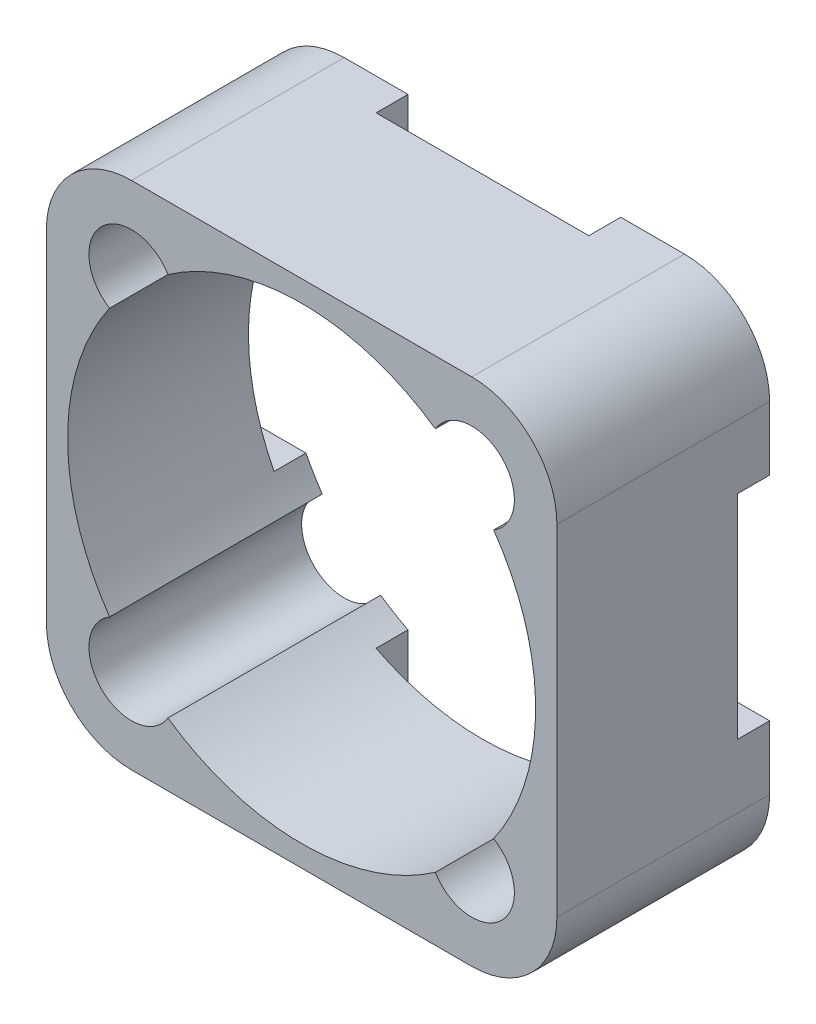
ISO-10303-21;
HEADER;
FILE_DESCRIPTION(('STEP AP214'),'2;1');
FILE_NAME('part.step','',(''),(''),'','','');
FILE_SCHEMA(('AUTOMOTIVE_DESIGN { 1 0 10303 214 1 1 1 1 }'));
ENDSEC;
DATA;
#1=APPLICATION_CONTEXT('core data for automotive mechanical design processes');
#2=APPLICATION_PROTOCOL_DEFINITION('international standard','automotive_design',2000,#1);
#3=PRODUCT_CONTEXT('',#1,'mechanical');
#4=PRODUCT('Part','Part','',(#3));
#5=PRODUCT_RELATED_PRODUCT_CATEGORY('part','',(#4));
#6=PRODUCT_DEFINITION_FORMATION('','',#4);
#7=PRODUCT_DEFINITION_CONTEXT('part definition',#1,'design');
#8=PRODUCT_DEFINITION('design','',#6,#7);
#9=PRODUCT_DEFINITION_SHAPE('','',#8);
#10=(LENGTH_UNIT() NAMED_UNIT(*) SI_UNIT(.MILLI.,.METRE.));
#11=(NAMED_UNIT(*) PLANE_ANGLE_UNIT() SI_UNIT($,.RADIAN.));
#12=(NAMED_UNIT(*) SI_UNIT($,.STERADIAN.) SOLID_ANGLE_UNIT());
#13=UNCERTAINTY_MEASURE_WITH_UNIT(LENGTH_MEASURE(1.E-05),#10,'distance_accuracy_value','');
#14=(GEOMETRIC_REPRESENTATION_CONTEXT(3) GLOBAL_UNCERTAINTY_ASSIGNED_CONTEXT((#13)) GLOBAL_UNIT_ASSIGNED_CONTEXT((#10,
#11,#12)) REPRESENTATION_CONTEXT('',''));
#15=CARTESIAN_POINT('',(0.,0.,0.));
#16=DIRECTION('',(0.,0.,1.));
#17=DIRECTION('',(1.,0.,0.));
#18=AXIS2_PLACEMENT_3D('',#15,#16,#17);
#19=CARTESIAN_POINT('',(-6.12,-6.12,0.92));
#20=DIRECTION('',(0.,0.,-1.));
#21=DIRECTION('',(-1.,0.,0.));
#22=AXIS2_PLACEMENT_3D('',#19,#20,#21);
#23=PLANE('',#22);
#24=DIRECTION('',(1.,0.,0.));
#25=VECTOR('',#24,1.);
#26=CARTESIAN_POINT('',(4.,-6.,0.92));
#27=LINE('',#26,#25);
#28=CARTESIAN_POINT('',(2.5,-6.,0.92));
#29=VERTEX_POINT('',#28);
#30=CARTESIAN_POINT('',(4.,-6.,0.92));
#31=VERTEX_POINT('',#30);
#32=EDGE_CURVE('E252',#29,#31,#27,.T.);
#33=ORIENTED_EDGE('',*,*,#32,.F.);
#34=DIRECTION('',(0.,1.,0.));
#35=VECTOR('',#34,1.);
#36=CARTESIAN_POINT('',(2.5,-11.,0.92));
#37=LINE('',#36,#35);
#38=CARTESIAN_POINT('',(2.49999999999996,-4.89897948556635,0.919999999999999));
#39=VERTEX_POINT('',#38);
#40=EDGE_CURVE('E197',#39,#29,#37,.F.);
#41=ORIENTED_EDGE('',*,*,#40,.F.);
#42=CARTESIAN_POINT('',(0.,-6.36457823692605E-13,0.919999999999998));
#43=DIRECTION('',(0.,0.,-1.));
#44=DIRECTION('',(0.,1.,0.));
#45=AXIS2_PLACEMENT_3D('',#42,#43,#44);
#46=CIRCLE('',#45,5.49999999999939);
#47=CARTESIAN_POINT('',(3.142224872887,-4.51402512711325,0.92));
#48=VERTEX_POINT('',#47);
#49=EDGE_CURVE('E21',#39,#48,#46,.F.);
#50=ORIENTED_EDGE('',*,*,#49,.T.);
#51=CARTESIAN_POINT('',(4.00000000000066,-3.99999999999867,0.92));
#52=DIRECTION('',(0.,0.,-1.));
#53=DIRECTION('',(-1.,0.,0.));
#54=AXIS2_PLACEMENT_3D('',#51,#52,#53);
#55=CIRCLE('',#54,0.999999999998758);
#56=CARTESIAN_POINT('',(4.51402512711403,-3.14222487288588,0.92));
#57=VERTEX_POINT('',#56);
#58=EDGE_CURVE('E194',#57,#48,#55,.T.);
#59=ORIENTED_EDGE('',*,*,#58,.F.);
#60=CARTESIAN_POINT('',(6.35156781085623E-13,0.,0.919999999999998));
#61=DIRECTION('',(0.,0.,-1.));
#62=DIRECTION('',(-1.,0.,0.));
#63=AXIS2_PLACEMENT_3D('',#60,#61,#62);
#64=CIRCLE('',#63,5.49999999999939);
#65=CARTESIAN_POINT('',(4.89897948556636,-2.49999999999995,0.919999999999999));
#66=VERTEX_POINT('',#65);
#67=EDGE_CURVE('E199',#57,#66,#64,.F.);
#68=ORIENTED_EDGE('',*,*,#67,.T.);
#69=DIRECTION('',(1.,0.,0.));
#70=VECTOR('',#69,1.);
#71=CARTESIAN_POINT('',(11.,-2.5,0.92));
#72=LINE('',#71,#70);
#73=CARTESIAN_POINT('',(6.,-2.5,0.92));
#74=VERTEX_POINT('',#73);
#75=EDGE_CURVE('E261',#74,#66,#72,.F.);
#76=ORIENTED_EDGE('',*,*,#75,.F.);
#77=DIRECTION('',(0.,1.,0.));
#78=VECTOR('',#77,1.);
#79=CARTESIAN_POINT('',(6.,4.,0.92));
#80=LINE('',#79,#78);
#81=CARTESIAN_POINT('',(6.,-4.,0.92));
#82=VERTEX_POINT('',#81);
#83=EDGE_CURVE('E239',#82,#74,#80,.T.);
#84=ORIENTED_EDGE('',*,*,#83,.F.);
#85=CARTESIAN_POINT('',(4.,-4.,0.920000000000001));
#86=DIRECTION('',(0.,0.,-1.));
#87=DIRECTION('',(-1.,0.,0.));
#88=AXIS2_PLACEMENT_3D('',#85,#86,#87);
#89=CIRCLE('',#88,2.00000000000007);
#90=EDGE_CURVE('E247',#31,#82,#89,.F.);
#91=ORIENTED_EDGE('',*,*,#90,.F.);
#92=EDGE_LOOP('',(#33,#41,#50,#59,#68,#76,#84,#91));
#93=FACE_BOUND('',#92,.T.);
#94=ADVANCED_FACE('F17',(#93),#23,.T.);
#95=CARTESIAN_POINT('',(-2.5,-11.,-2.33));
#96=DIRECTION('',(1.,0.,0.));
#97=DIRECTION('',(0.,0.,-1.));
#98=AXIS2_PLACEMENT_3D('',#95,#96,#97);
#99=PLANE('',#98);
#100=DIRECTION('',(0.,1.,0.));
#101=VECTOR('',#100,1.);
#102=CARTESIAN_POINT('',(-2.5,-11.,1.67));
#103=LINE('',#102,#101);
#104=CARTESIAN_POINT('',(-2.5,-6.,1.67));
#105=VERTEX_POINT('',#104);
#106=CARTESIAN_POINT('',(-2.49999999999996,-4.89897948556635,1.67));
#107=VERTEX_POINT('',#106);
#108=EDGE_CURVE('E346',#105,#107,#103,.T.);
#109=ORIENTED_EDGE('',*,*,#108,.F.);
#110=DIRECTION('',(0.,0.,-1.));
#111=VECTOR('',#110,1.);
#112=CARTESIAN_POINT('',(-2.5,-6.,5.92));
#113=LINE('',#112,#111);
#114=CARTESIAN_POINT('',(-2.5,-6.,0.92));
#115=VERTEX_POINT('',#114);
#116=EDGE_CURVE('E421',#115,#105,#113,.F.);
#117=ORIENTED_EDGE('',*,*,#116,.F.);
#118=DIRECTION('',(0.,1.,0.));
#119=VECTOR('',#118,1.);
#120=CARTESIAN_POINT('',(-2.5,-6.12,0.92));
#121=LINE('',#120,#119);
#122=CARTESIAN_POINT('',(-2.49999999999996,-4.89897948556635,0.919999999999999));
#123=VERTEX_POINT('',#122);
#124=EDGE_CURVE('E328',#123,#115,#121,.F.);
#125=ORIENTED_EDGE('',*,*,#124,.F.);
#126=DIRECTION('',(0.,0.,-1.));
#127=VECTOR('',#126,1.);
#128=CARTESIAN_POINT('',(-2.49999999999991,-4.89897948556641,3.42));
#129=LINE('',#128,#127);
#130=EDGE_CURVE('E206',#107,#123,#129,.T.);
#131=ORIENTED_EDGE('',*,*,#130,.F.);
#132=EDGE_LOOP('',(#109,#117,#125,#131));
#133=FACE_BOUND('',#132,.T.);
#134=ADVANCED_FACE('F566',(#133),#99,.T.);
#135=CARTESIAN_POINT('',(2.5,-11.,1.67));
#136=DIRECTION('',(-1.,0.,0.));
#137=DIRECTION('',(0.,0.,1.));
#138=AXIS2_PLACEMENT_3D('',#135,#136,#137);
#139=PLANE('',#138);
#140=DIRECTION('',(0.,1.,0.));
#141=VECTOR('',#140,1.);
#142=CARTESIAN_POINT('',(2.5,-11.,1.67));
#143=LINE('',#142,#141);
#144=CARTESIAN_POINT('',(2.49999999999996,-4.89897948556635,1.67));
#145=VERTEX_POINT('',#144);
#146=CARTESIAN_POINT('',(2.5,-6.,1.67));
#147=VERTEX_POINT('',#146);
#148=EDGE_CURVE('E349',#145,#147,#143,.F.);
#149=ORIENTED_EDGE('',*,*,#148,.F.);
#150=DIRECTION('',(0.,0.,1.));
#151=VECTOR('',#150,1.);
#152=CARTESIAN_POINT('',(2.49999999999991,-4.8989794855664,3.42));
#153=LINE('',#152,#151);
#154=EDGE_CURVE('E213',#39,#145,#153,.T.);
#155=ORIENTED_EDGE('',*,*,#154,.F.);
#156=ORIENTED_EDGE('',*,*,#40,.T.);
#157=DIRECTION('',(0.,0.,-1.));
#158=VECTOR('',#157,1.);
#159=CARTESIAN_POINT('',(2.5,-6.,5.92));
#160=LINE('',#159,#158);
#161=EDGE_CURVE('E414',#147,#29,#160,.T.);
#162=ORIENTED_EDGE('',*,*,#161,.F.);
#163=EDGE_LOOP('',(#149,#155,#156,#162));
#164=FACE_BOUND('',#163,.T.);
#165=ADVANCED_FACE('F558',(#164),#139,.T.);
#166=CARTESIAN_POINT('',(-2.5,-11.,1.67));
#167=DIRECTION('',(0.,0.,-1.));
#168=DIRECTION('',(-1.,0.,0.));
#169=AXIS2_PLACEMENT_3D('',#166,#167,#168);
#170=PLANE('',#169);
#171=DIRECTION('',(1.,0.,0.));
#172=VECTOR('',#171,1.);
#173=CARTESIAN_POINT('',(4.,-6.,1.67));
#174=LINE('',#173,#172);
#175=EDGE_CURVE('E424',#105,#147,#174,.T.);
#176=ORIENTED_EDGE('',*,*,#175,.F.);
#177=ORIENTED_EDGE('',*,*,#108,.T.);
#178=CARTESIAN_POINT('',(0.,-6.36160416839492E-13,1.67));
#179=DIRECTION('',(0.,0.,-1.));
#180=DIRECTION('',(0.,1.,0.));
#181=AXIS2_PLACEMENT_3D('',#178,#179,#180);
#182=CIRCLE('',#181,5.49999999999939);
#183=EDGE_CURVE('E216',#145,#107,#182,.T.);
#184=ORIENTED_EDGE('',*,*,#183,.F.);
#185=ORIENTED_EDGE('',*,*,#148,.T.);
#186=EDGE_LOOP('',(#176,#177,#184,#185));
#187=FACE_BOUND('',#186,.T.);
#188=ADVANCED_FACE('F562',(#187),#170,.T.);
#189=CARTESIAN_POINT('',(-6.12,-6.12,0.92));
#190=DIRECTION('',(0.,0.,-1.));
#191=DIRECTION('',(-1.,0.,0.));
#192=AXIS2_PLACEMENT_3D('',#189,#190,#191);
#193=PLANE('',#192);
#194=CARTESIAN_POINT('',(0.,-6.36457823692605E-13,0.919999999999998));
#195=DIRECTION('',(0.,0.,-1.));
#196=DIRECTION('',(0.,1.,0.));
#197=AXIS2_PLACEMENT_3D('',#194,#195,#196);
#198=CIRCLE('',#197,5.49999999999939);
#199=CARTESIAN_POINT('',(-3.14222487288588,-4.51402512711403,0.92));
#200=VERTEX_POINT('',#199);
#201=EDGE_CURVE('E214',#123,#200,#198,.T.);
#202=ORIENTED_EDGE('',*,*,#201,.F.);
#203=ORIENTED_EDGE('',*,*,#124,.T.);
#204=DIRECTION('',(1.,0.,0.));
#205=VECTOR('',#204,1.);
#206=CARTESIAN_POINT('',(4.,-6.,0.92));
#207=LINE('',#206,#205);
#208=CARTESIAN_POINT('',(-4.,-6.,0.92));
#209=VERTEX_POINT('',#208);
#210=EDGE_CURVE('E248',#209,#115,#207,.T.);
#211=ORIENTED_EDGE('',*,*,#210,.F.);
#212=CARTESIAN_POINT('',(-4.,-4.,0.920000000000001));
#213=DIRECTION('',(0.,0.,-1.));
#214=DIRECTION('',(-1.,0.,0.));
#215=AXIS2_PLACEMENT_3D('',#212,#213,#214);
#216=CIRCLE('',#215,2.00000000000007);
#217=CARTESIAN_POINT('',(-6.,-4.,0.92));
#218=VERTEX_POINT('',#217);
#219=EDGE_CURVE('E256',#218,#209,#216,.F.);
#220=ORIENTED_EDGE('',*,*,#219,.F.);
#221=DIRECTION('',(0.,1.,0.));
#222=VECTOR('',#221,1.);
#223=CARTESIAN_POINT('',(-6.,-4.,0.92));
#224=LINE('',#223,#222);
#225=CARTESIAN_POINT('',(-6.,-2.5,0.92));
#226=VERTEX_POINT('',#225);
#227=EDGE_CURVE('E363',#226,#218,#224,.F.);
#228=ORIENTED_EDGE('',*,*,#227,.F.);
#229=DIRECTION('',(1.,0.,0.));
#230=VECTOR('',#229,1.);
#231=CARTESIAN_POINT('',(11.,-2.5,0.92));
#232=LINE('',#231,#230);
#233=CARTESIAN_POINT('',(-4.89897948556635,-2.49999999999995,0.919999999999999));
#234=VERTEX_POINT('',#233);
#235=EDGE_CURVE('E333',#234,#226,#232,.F.);
#236=ORIENTED_EDGE('',*,*,#235,.F.);
#237=CARTESIAN_POINT('',(-6.35156781085623E-13,0.,0.919999999999998));
#238=DIRECTION('',(0.,0.,-1.));
#239=DIRECTION('',(-1.,0.,0.));
#240=AXIS2_PLACEMENT_3D('',#237,#238,#239);
#241=CIRCLE('',#240,5.49999999999939);
#242=CARTESIAN_POINT('',(-4.51402512711325,-3.142224872887,0.92));
#243=VERTEX_POINT('',#242);
#244=EDGE_CURVE('E343',#234,#243,#241,.F.);
#245=ORIENTED_EDGE('',*,*,#244,.T.);
#246=CARTESIAN_POINT('',(-3.99999999999867,-4.00000000000066,0.92));
#247=DIRECTION('',(0.,0.,-1.));
#248=DIRECTION('',(-1.,0.,0.));
#249=AXIS2_PLACEMENT_3D('',#246,#247,#248);
#250=CIRCLE('',#249,0.999999999998758);
#251=EDGE_CURVE('E502',#200,#243,#250,.T.);
#252=ORIENTED_EDGE('',*,*,#251,.F.);
#253=EDGE_LOOP('',(#202,#203,#211,#220,#228,#236,#245,#252));
#254=FACE_BOUND('',#253,.T.);
#255=ADVANCED_FACE('F569',(#254),#193,.T.);
#256=CARTESIAN_POINT('',(11.,-2.5,1.67));
#257=DIRECTION('',(0.,0.,-1.));
#258=DIRECTION('',(-1.,0.,0.));
#259=AXIS2_PLACEMENT_3D('',#256,#257,#258);
#260=PLANE('',#259);
#261=DIRECTION('',(1.,0.,0.));
#262=VECTOR('',#261,1.);
#263=CARTESIAN_POINT('',(11.,-2.5,1.67));
#264=LINE('',#263,#262);
#265=CARTESIAN_POINT('',(-6.,-2.5,1.67));
#266=VERTEX_POINT('',#265);
#267=CARTESIAN_POINT('',(-4.89897948556635,-2.49999999999995,1.67));
#268=VERTEX_POINT('',#267);
#269=EDGE_CURVE('E327',#266,#268,#264,.T.);
#270=ORIENTED_EDGE('',*,*,#269,.F.);
#271=DIRECTION('',(0.,1.,0.));
#272=VECTOR('',#271,1.);
#273=CARTESIAN_POINT('',(-6.,-4.,1.67));
#274=LINE('',#273,#272);
#275=CARTESIAN_POINT('',(-6.,2.5,1.67));
#276=VERTEX_POINT('',#275);
#277=EDGE_CURVE('E441',#276,#266,#274,.F.);
#278=ORIENTED_EDGE('',*,*,#277,.F.);
#279=DIRECTION('',(1.,0.,0.));
#280=VECTOR('',#279,1.);
#281=CARTESIAN_POINT('',(11.,2.5,1.67));
#282=LINE('',#281,#280);
#283=CARTESIAN_POINT('',(-4.89897948556635,2.49999999999995,1.67));
#284=VERTEX_POINT('',#283);
#285=EDGE_CURVE('E324',#284,#276,#282,.F.);
#286=ORIENTED_EDGE('',*,*,#285,.F.);
#287=CARTESIAN_POINT('',(-6.34859374232509E-13,0.,1.67));
#288=DIRECTION('',(0.,0.,-1.));
#289=DIRECTION('',(-1.,0.,0.));
#290=AXIS2_PLACEMENT_3D('',#287,#288,#289);
#291=CIRCLE('',#290,5.49999999999939);
#292=EDGE_CURVE('E323',#268,#284,#291,.T.);
#293=ORIENTED_EDGE('',*,*,#292,.F.);
#294=EDGE_LOOP('',(#270,#278,#286,#293));
#295=FACE_BOUND('',#294,.T.);
#296=ADVANCED_FACE('F667',(#295),#260,.T.);
#297=CARTESIAN_POINT('',(11.,2.5,1.67));
#298=DIRECTION('',(0.,-1.,0.));
#299=DIRECTION('',(0.,0.,-1.));
#300=AXIS2_PLACEMENT_3D('',#297,#298,#299);
#301=PLANE('',#300);
#302=ORIENTED_EDGE('',*,*,#285,.T.);
#303=DIRECTION('',(0.,0.,1.));
#304=VECTOR('',#303,1.);
#305=CARTESIAN_POINT('',(-6.,2.5,5.92));
#306=LINE('',#305,#304);
#307=CARTESIAN_POINT('',(-6.,2.5,0.92));
#308=VERTEX_POINT('',#307);
#309=EDGE_CURVE('E276',#308,#276,#306,.T.);
#310=ORIENTED_EDGE('',*,*,#309,.F.);
#311=DIRECTION('',(-1.,0.,0.));
#312=VECTOR('',#311,1.);
#313=CARTESIAN_POINT('',(-6.12,2.5,0.92));
#314=LINE('',#313,#312);
#315=CARTESIAN_POINT('',(-4.89897948556635,2.49999999999995,0.919999999999999));
#316=VERTEX_POINT('',#315);
#317=EDGE_CURVE('E311',#316,#308,#314,.T.);
#318=ORIENTED_EDGE('',*,*,#317,.F.);
#319=DIRECTION('',(0.,0.,-1.));
#320=VECTOR('',#319,1.);
#321=CARTESIAN_POINT('',(-4.8989794855664,2.49999999999991,3.42));
#322=LINE('',#321,#320);
#323=EDGE_CURVE('E319',#284,#316,#322,.T.);
#324=ORIENTED_EDGE('',*,*,#323,.F.);
#325=EDGE_LOOP('',(#302,#310,#318,#324));
#326=FACE_BOUND('',#325,.T.);
#327=ADVANCED_FACE('F663',(#326),#301,.T.);
#328=CARTESIAN_POINT('',(11.,-2.5,-2.33));
#329=DIRECTION('',(0.,1.,0.));
#330=DIRECTION('',(0.,0.,1.));
#331=AXIS2_PLACEMENT_3D('',#328,#329,#330);
#332=PLANE('',#331);
#333=ORIENTED_EDGE('',*,*,#235,.T.);
#334=DIRECTION('',(0.,0.,1.));
#335=VECTOR('',#334,1.);
#336=CARTESIAN_POINT('',(-6.,-2.5,5.92));
#337=LINE('',#336,#335);
#338=EDGE_CURVE('E436',#266,#226,#337,.F.);
#339=ORIENTED_EDGE('',*,*,#338,.F.);
#340=ORIENTED_EDGE('',*,*,#269,.T.);
#341=DIRECTION('',(0.,0.,1.));
#342=VECTOR('',#341,1.);
#343=CARTESIAN_POINT('',(-4.8989794855664,-2.49999999999991,3.42));
#344=LINE('',#343,#342);
#345=EDGE_CURVE('E336',#234,#268,#344,.T.);
#346=ORIENTED_EDGE('',*,*,#345,.F.);
#347=EDGE_LOOP('',(#333,#339,#340,#346));
#348=FACE_BOUND('',#347,.T.);
#349=ADVANCED_FACE('F659',(#348),#332,.T.);
#350=CARTESIAN_POINT('',(-6.12,-6.12,0.92));
#351=DIRECTION('',(0.,0.,-1.));
#352=DIRECTION('',(-1.,0.,0.));
#353=AXIS2_PLACEMENT_3D('',#350,#351,#352);
#354=PLANE('',#353);
#355=DIRECTION('',(1.,0.,0.));
#356=VECTOR('',#355,1.);
#357=CARTESIAN_POINT('',(-4.,6.,0.92));
#358=LINE('',#357,#356);
#359=CARTESIAN_POINT('',(-2.5,6.,0.92));
#360=VERTEX_POINT('',#359);
#361=CARTESIAN_POINT('',(-4.,6.,0.92));
#362=VERTEX_POINT('',#361);
#363=EDGE_CURVE('E234',#360,#362,#358,.F.);
#364=ORIENTED_EDGE('',*,*,#363,.F.);
#365=DIRECTION('',(0.,1.,0.));
#366=VECTOR('',#365,1.);
#367=CARTESIAN_POINT('',(-2.5,-11.,0.92));
#368=LINE('',#367,#366);
#369=CARTESIAN_POINT('',(-2.49999999999995,4.89897948556636,0.919999999999999));
#370=VERTEX_POINT('',#369);
#371=EDGE_CURVE('E293',#370,#360,#368,.T.);
#372=ORIENTED_EDGE('',*,*,#371,.F.);
#373=CARTESIAN_POINT('',(0.,6.36024142823611E-13,0.919999999999998));
#374=DIRECTION('',(0.,0.,-1.));
#375=DIRECTION('',(0.,1.,0.));
#376=AXIS2_PLACEMENT_3D('',#373,#374,#375);
#377=CIRCLE('',#376,5.49999999999939);
#378=CARTESIAN_POINT('',(-3.142224872887,4.51402512711325,0.92));
#379=VERTEX_POINT('',#378);
#380=EDGE_CURVE('E316',#370,#379,#377,.F.);
#381=ORIENTED_EDGE('',*,*,#380,.T.);
#382=CARTESIAN_POINT('',(-4.00000000000066,3.99999999999867,0.92));
#383=DIRECTION('',(0.,0.,-1.));
#384=DIRECTION('',(-1.,0.,0.));
#385=AXIS2_PLACEMENT_3D('',#382,#383,#384);
#386=CIRCLE('',#385,0.999999999998758);
#387=CARTESIAN_POINT('',(-4.51402512711403,3.14222487288588,0.92));
#388=VERTEX_POINT('',#387);
#389=EDGE_CURVE('E496',#388,#379,#386,.T.);
#390=ORIENTED_EDGE('',*,*,#389,.F.);
#391=CARTESIAN_POINT('',(-6.35156781085623E-13,0.,0.919999999999998));
#392=DIRECTION('',(0.,0.,-1.));
#393=DIRECTION('',(-1.,0.,0.));
#394=AXIS2_PLACEMENT_3D('',#391,#392,#393);
#395=CIRCLE('',#394,5.49999999999939);
#396=EDGE_CURVE('E322',#316,#388,#395,.T.);
#397=ORIENTED_EDGE('',*,*,#396,.F.);
#398=ORIENTED_EDGE('',*,*,#317,.T.);
#399=DIRECTION('',(0.,1.,0.));
#400=VECTOR('',#399,1.);
#401=CARTESIAN_POINT('',(-6.,-4.,0.92));
#402=LINE('',#401,#400);
#403=CARTESIAN_POINT('',(-6.,4.,0.92));
#404=VERTEX_POINT('',#403);
#405=EDGE_CURVE('E257',#404,#308,#402,.F.);
#406=ORIENTED_EDGE('',*,*,#405,.F.);
#407=CARTESIAN_POINT('',(-4.,4.,0.920000000000001));
#408=DIRECTION('',(0.,0.,-1.));
#409=DIRECTION('',(-1.,0.,0.));
#410=AXIS2_PLACEMENT_3D('',#407,#408,#409);
#411=CIRCLE('',#410,2.00000000000007);
#412=EDGE_CURVE('E225',#362,#404,#411,.F.);
#413=ORIENTED_EDGE('',*,*,#412,.F.);
#414=EDGE_LOOP('',(#364,#372,#381,#390,#397,#398,#406,#413));
#415=FACE_BOUND('',#414,.T.);
#416=ADVANCED_FACE('F655',(#415),#354,.T.);
#417=CARTESIAN_POINT('',(-2.5,-11.,-2.33));
#418=DIRECTION('',(1.,0.,0.));
#419=DIRECTION('',(0.,0.,-1.));
#420=AXIS2_PLACEMENT_3D('',#417,#418,#419);
#421=PLANE('',#420);
#422=ORIENTED_EDGE('',*,*,#371,.T.);
#423=DIRECTION('',(0.,0.,1.));
#424=VECTOR('',#423,1.);
#425=CARTESIAN_POINT('',(-2.5,6.,5.92));
#426=LINE('',#425,#424);
#427=CARTESIAN_POINT('',(-2.5,6.,1.67));
#428=VERTEX_POINT('',#427);
#429=EDGE_CURVE('E367',#428,#360,#426,.F.);
#430=ORIENTED_EDGE('',*,*,#429,.F.);
#431=DIRECTION('',(0.,1.,0.));
#432=VECTOR('',#431,1.);
#433=CARTESIAN_POINT('',(-2.5,-11.,1.67));
#434=LINE('',#433,#432);
#435=CARTESIAN_POINT('',(-2.49999999999995,4.89897948556636,1.67));
#436=VERTEX_POINT('',#435);
#437=EDGE_CURVE('E289',#436,#428,#434,.T.);
#438=ORIENTED_EDGE('',*,*,#437,.F.);
#439=DIRECTION('',(0.,0.,1.));
#440=VECTOR('',#439,1.);
#441=CARTESIAN_POINT('',(-2.4999999999999,4.89897948556641,3.42));
#442=LINE('',#441,#440);
#443=EDGE_CURVE('E296',#370,#436,#442,.T.);
#444=ORIENTED_EDGE('',*,*,#443,.F.);
#445=EDGE_LOOP('',(#422,#430,#438,#444));
#446=FACE_BOUND('',#445,.T.);
#447=ADVANCED_FACE('F651',(#446),#421,.T.);
#448=CARTESIAN_POINT('',(-2.5,-11.,1.67));
#449=DIRECTION('',(0.,0.,-1.));
#450=DIRECTION('',(-1.,0.,0.));
#451=AXIS2_PLACEMENT_3D('',#448,#449,#450);
#452=PLANE('',#451);
#453=ORIENTED_EDGE('',*,*,#437,.T.);
#454=DIRECTION('',(1.,0.,0.));
#455=VECTOR('',#454,1.);
#456=CARTESIAN_POINT('',(-4.,6.,1.67));
#457=LINE('',#456,#455);
#458=CARTESIAN_POINT('',(2.5,6.,1.67));
#459=VERTEX_POINT('',#458);
#460=EDGE_CURVE('E229',#459,#428,#457,.F.);
#461=ORIENTED_EDGE('',*,*,#460,.F.);
#462=DIRECTION('',(0.,1.,0.));
#463=VECTOR('',#462,1.);
#464=CARTESIAN_POINT('',(2.5,-11.,1.67));
#465=LINE('',#464,#463);
#466=CARTESIAN_POINT('',(2.49999999999995,4.89897948556636,1.67));
#467=VERTEX_POINT('',#466);
#468=EDGE_CURVE('E292',#467,#459,#465,.T.);
#469=ORIENTED_EDGE('',*,*,#468,.F.);
#470=CARTESIAN_POINT('',(0.,6.35726735970498E-13,1.67));
#471=DIRECTION('',(0.,0.,-1.));
#472=DIRECTION('',(0.,1.,0.));
#473=AXIS2_PLACEMENT_3D('',#470,#471,#472);
#474=CIRCLE('',#473,5.49999999999939);
#475=EDGE_CURVE('E299',#436,#467,#474,.T.);
#476=ORIENTED_EDGE('',*,*,#475,.F.);
#477=EDGE_LOOP('',(#453,#461,#469,#476));
#478=FACE_BOUND('',#477,.T.);
#479=ADVANCED_FACE('F647',(#478),#452,.T.);
#480=CARTESIAN_POINT('',(2.5,-11.,1.67));
#481=DIRECTION('',(-1.,0.,0.));
#482=DIRECTION('',(0.,0.,1.));
#483=AXIS2_PLACEMENT_3D('',#480,#481,#482);
#484=PLANE('',#483);
#485=ORIENTED_EDGE('',*,*,#468,.T.);
#486=DIRECTION('',(0.,0.,1.));
#487=VECTOR('',#486,1.);
#488=CARTESIAN_POINT('',(2.5,6.,5.92));
#489=LINE('',#488,#487);
#490=CARTESIAN_POINT('',(2.5,6.,0.92));
#491=VERTEX_POINT('',#490);
#492=EDGE_CURVE('E372',#491,#459,#489,.T.);
#493=ORIENTED_EDGE('',*,*,#492,.F.);
#494=DIRECTION('',(0.,1.,0.));
#495=VECTOR('',#494,1.);
#496=CARTESIAN_POINT('',(2.5,-6.12,0.92));
#497=LINE('',#496,#495);
#498=CARTESIAN_POINT('',(2.49999999999995,4.89897948556636,0.919999999999999));
#499=VERTEX_POINT('',#498);
#500=EDGE_CURVE('E281',#499,#491,#497,.T.);
#501=ORIENTED_EDGE('',*,*,#500,.F.);
#502=DIRECTION('',(0.,0.,-1.));
#503=VECTOR('',#502,1.);
#504=CARTESIAN_POINT('',(2.49999999999991,4.8989794855664,3.42));
#505=LINE('',#504,#503);
#506=EDGE_CURVE('E301',#467,#499,#505,.T.);
#507=ORIENTED_EDGE('',*,*,#506,.F.);
#508=EDGE_LOOP('',(#485,#493,#501,#507));
#509=FACE_BOUND('',#508,.T.);
#510=ADVANCED_FACE('F643',(#509),#484,.T.);
#511=CARTESIAN_POINT('',(-6.12,-6.12,0.92));
#512=DIRECTION('',(0.,0.,-1.));
#513=DIRECTION('',(-1.,0.,0.));
#514=AXIS2_PLACEMENT_3D('',#511,#512,#513);
#515=PLANE('',#514);
#516=CARTESIAN_POINT('',(0.,6.36024142823611E-13,0.919999999999998));
#517=DIRECTION('',(0.,0.,-1.));
#518=DIRECTION('',(0.,1.,0.));
#519=AXIS2_PLACEMENT_3D('',#516,#517,#518);
#520=CIRCLE('',#519,5.49999999999939);
#521=CARTESIAN_POINT('',(3.14222487288588,4.51402512711403,0.92));
#522=VERTEX_POINT('',#521);
#523=EDGE_CURVE('E494',#499,#522,#520,.T.);
#524=ORIENTED_EDGE('',*,*,#523,.F.);
#525=ORIENTED_EDGE('',*,*,#500,.T.);
#526=DIRECTION('',(1.,0.,0.));
#527=VECTOR('',#526,1.);
#528=CARTESIAN_POINT('',(-4.,6.,0.92));
#529=LINE('',#528,#527);
#530=CARTESIAN_POINT('',(4.,6.,0.92));
#531=VERTEX_POINT('',#530);
#532=EDGE_CURVE('E233',#531,#491,#529,.F.);
#533=ORIENTED_EDGE('',*,*,#532,.F.);
#534=CARTESIAN_POINT('',(4.,4.,0.920000000000001));
#535=DIRECTION('',(0.,0.,-1.));
#536=DIRECTION('',(-1.,0.,0.));
#537=AXIS2_PLACEMENT_3D('',#534,#535,#536);
#538=CIRCLE('',#537,2.00000000000007);
#539=CARTESIAN_POINT('',(6.,4.,0.92));
#540=VERTEX_POINT('',#539);
#541=EDGE_CURVE('E238',#540,#531,#538,.F.);
#542=ORIENTED_EDGE('',*,*,#541,.F.);
#543=DIRECTION('',(0.,1.,0.));
#544=VECTOR('',#543,1.);
#545=CARTESIAN_POINT('',(6.,4.,0.92));
#546=LINE('',#545,#544);
#547=CARTESIAN_POINT('',(6.,2.5,0.92));
#548=VERTEX_POINT('',#547);
#549=EDGE_CURVE('E243',#548,#540,#546,.T.);
#550=ORIENTED_EDGE('',*,*,#549,.F.);
#551=DIRECTION('',(1.,0.,0.));
#552=VECTOR('',#551,1.);
#553=CARTESIAN_POINT('',(11.,2.5,0.92));
#554=LINE('',#553,#552);
#555=CARTESIAN_POINT('',(4.89897948556636,2.49999999999995,0.919999999999999));
#556=VERTEX_POINT('',#555);
#557=EDGE_CURVE('E262',#556,#548,#554,.T.);
#558=ORIENTED_EDGE('',*,*,#557,.F.);
#559=CARTESIAN_POINT('',(6.35156781085623E-13,0.,0.919999999999998));
#560=DIRECTION('',(0.,0.,-1.));
#561=DIRECTION('',(-1.,0.,0.));
#562=AXIS2_PLACEMENT_3D('',#559,#560,#561);
#563=CIRCLE('',#562,5.49999999999939);
#564=CARTESIAN_POINT('',(4.51402512711325,3.142224872887,0.92));
#565=VERTEX_POINT('',#564);
#566=EDGE_CURVE('E286',#556,#565,#563,.F.);
#567=ORIENTED_EDGE('',*,*,#566,.T.);
#568=CARTESIAN_POINT('',(3.99999999999867,4.00000000000066,0.92));
#569=DIRECTION('',(0.,0.,-1.));
#570=DIRECTION('',(-1.,0.,0.));
#571=AXIS2_PLACEMENT_3D('',#568,#569,#570);
#572=CIRCLE('',#571,0.999999999998758);
#573=EDGE_CURVE('E490',#522,#565,#572,.T.);
#574=ORIENTED_EDGE('',*,*,#573,.F.);
#575=EDGE_LOOP('',(#524,#525,#533,#542,#550,#558,#567,#574));
#576=FACE_BOUND('',#575,.T.);
#577=ADVANCED_FACE('F639',(#576),#515,.T.);
#578=CARTESIAN_POINT('',(11.,2.5,1.67));
#579=DIRECTION('',(0.,-1.,0.));
#580=DIRECTION('',(0.,0.,-1.));
#581=AXIS2_PLACEMENT_3D('',#578,#579,#580);
#582=PLANE('',#581);
#583=DIRECTION('',(-1.,0.,0.));
#584=VECTOR('',#583,1.);
#585=CARTESIAN_POINT('',(11.,2.5,1.67));
#586=LINE('',#585,#584);
#587=CARTESIAN_POINT('',(4.89897948556636,2.49999999999995,1.67));
#588=VERTEX_POINT('',#587);
#589=CARTESIAN_POINT('',(6.,2.5,1.67));
#590=VERTEX_POINT('',#589);
#591=EDGE_CURVE('E258',#588,#590,#586,.F.);
#592=ORIENTED_EDGE('',*,*,#591,.F.);
#593=DIRECTION('',(0.,0.,1.));
#594=VECTOR('',#593,1.);
#595=CARTESIAN_POINT('',(4.89897948556641,2.49999999999991,3.42));
#596=LINE('',#595,#594);
#597=EDGE_CURVE('E265',#556,#588,#596,.T.);
#598=ORIENTED_EDGE('',*,*,#597,.F.);
#599=ORIENTED_EDGE('',*,*,#557,.T.);
#600=DIRECTION('',(0.,0.,-1.));
#601=VECTOR('',#600,1.);
#602=CARTESIAN_POINT('',(6.,2.5,5.92));
#603=LINE('',#602,#601);
#604=EDGE_CURVE('E388',#590,#548,#603,.T.);
#605=ORIENTED_EDGE('',*,*,#604,.F.);
#606=EDGE_LOOP('',(#592,#598,#599,#605));
#607=FACE_BOUND('',#606,.T.);
#608=ADVANCED_FACE('F636',(#607),#582,.T.);
#609=CARTESIAN_POINT('',(11.,-2.5,1.67));
#610=DIRECTION('',(0.,0.,-1.));
#611=DIRECTION('',(-1.,0.,0.));
#612=AXIS2_PLACEMENT_3D('',#609,#610,#611);
#613=PLANE('',#612);
#614=DIRECTION('',(0.,1.,0.));
#615=VECTOR('',#614,1.);
#616=CARTESIAN_POINT('',(6.,4.,1.67));
#617=LINE('',#616,#615);
#618=CARTESIAN_POINT('',(6.,-2.5,1.67));
#619=VERTEX_POINT('',#618);
#620=EDGE_CURVE('E398',#619,#590,#617,.T.);
#621=ORIENTED_EDGE('',*,*,#620,.F.);
#622=DIRECTION('',(1.,0.,0.));
#623=VECTOR('',#622,1.);
#624=CARTESIAN_POINT('',(11.,-2.5,1.67));
#625=LINE('',#624,#623);
#626=CARTESIAN_POINT('',(4.89897948556636,-2.49999999999995,1.67));
#627=VERTEX_POINT('',#626);
#628=EDGE_CURVE('E273',#627,#619,#625,.T.);
#629=ORIENTED_EDGE('',*,*,#628,.F.);
#630=CARTESIAN_POINT('',(6.34859374232509E-13,0.,1.67));
#631=DIRECTION('',(0.,0.,-1.));
#632=DIRECTION('',(-1.,0.,0.));
#633=AXIS2_PLACEMENT_3D('',#630,#631,#632);
#634=CIRCLE('',#633,5.49999999999939);
#635=EDGE_CURVE('E268',#588,#627,#634,.T.);
#636=ORIENTED_EDGE('',*,*,#635,.F.);
#637=ORIENTED_EDGE('',*,*,#591,.T.);
#638=EDGE_LOOP('',(#621,#629,#636,#637));
#639=FACE_BOUND('',#638,.T.);
#640=ADVANCED_FACE('F525',(#639),#613,.T.);
#641=CARTESIAN_POINT('',(11.,-2.5,-2.33));
#642=DIRECTION('',(0.,1.,0.));
#643=DIRECTION('',(0.,0.,1.));
#644=AXIS2_PLACEMENT_3D('',#641,#642,#643);
#645=PLANE('',#644);
#646=ORIENTED_EDGE('',*,*,#628,.T.);
#647=DIRECTION('',(0.,0.,-1.));
#648=VECTOR('',#647,1.);
#649=CARTESIAN_POINT('',(6.,-2.5,5.92));
#650=LINE('',#649,#648);
#651=EDGE_CURVE('E395',#74,#619,#650,.F.);
#652=ORIENTED_EDGE('',*,*,#651,.F.);
#653=ORIENTED_EDGE('',*,*,#75,.T.);
#654=DIRECTION('',(0.,0.,-1.));
#655=VECTOR('',#654,1.);
#656=CARTESIAN_POINT('',(4.89897948556641,-2.49999999999991,3.42));
#657=LINE('',#656,#655);
#658=EDGE_CURVE('E269',#627,#66,#657,.T.);
#659=ORIENTED_EDGE('',*,*,#658,.F.);
#660=EDGE_LOOP('',(#646,#652,#653,#659));
#661=FACE_BOUND('',#660,.T.);
#662=ADVANCED_FACE('F520',(#661),#645,.T.);
#663=CARTESIAN_POINT('',(-6.,-4.,5.92));
#664=DIRECTION('',(-1.,0.,0.));
#665=DIRECTION('',(0.,0.,1.));
#666=AXIS2_PLACEMENT_3D('',#663,#664,#665);
#667=PLANE('',#666);
#668=DIRECTION('',(0.,0.,1.));
#669=VECTOR('',#668,1.);
#670=CARTESIAN_POINT('',(-6.,4.,3.42));
#671=LINE('',#670,#669);
#672=CARTESIAN_POINT('',(-6.,4.,5.92));
#673=VERTEX_POINT('',#672);
#674=EDGE_CURVE('E207',#404,#673,#671,.T.);
#675=ORIENTED_EDGE('',*,*,#674,.F.);
#676=ORIENTED_EDGE('',*,*,#405,.T.);
#677=ORIENTED_EDGE('',*,*,#309,.T.);
#678=ORIENTED_EDGE('',*,*,#277,.T.);
#679=ORIENTED_EDGE('',*,*,#338,.T.);
#680=ORIENTED_EDGE('',*,*,#227,.T.);
#681=DIRECTION('',(0.,0.,-1.));
#682=VECTOR('',#681,1.);
#683=CARTESIAN_POINT('',(-6.,-4.,3.42));
#684=LINE('',#683,#682);
#685=CARTESIAN_POINT('',(-6.,-4.,5.92));
#686=VERTEX_POINT('',#685);
#687=EDGE_CURVE('E253',#686,#218,#684,.T.);
#688=ORIENTED_EDGE('',*,*,#687,.F.);
#689=DIRECTION('',(0.,1.,0.));
#690=VECTOR('',#689,1.);
#691=CARTESIAN_POINT('',(-6.,-6.12,5.92));
#692=LINE('',#691,#690);
#693=EDGE_CURVE('E272',#673,#686,#692,.F.);
#694=ORIENTED_EDGE('',*,*,#693,.F.);
#695=EDGE_LOOP('',(#675,#676,#677,#678,#679,#680,#688,#694));
#696=FACE_BOUND('',#695,.T.);
#697=ADVANCED_FACE('F628',(#696),#667,.T.);
#698=CARTESIAN_POINT('',(-4.,-4.,5.92));
#699=DIRECTION('',(0.,0.,-1.));
#700=DIRECTION('',(-1.,0.,0.));
#701=AXIS2_PLACEMENT_3D('',#698,#699,#700);
#702=CYLINDRICAL_SURFACE('',#701,2.00000000000007);
#703=ORIENTED_EDGE('',*,*,#219,.T.);
#704=DIRECTION('',(0.,0.,-1.));
#705=VECTOR('',#704,1.);
#706=CARTESIAN_POINT('',(-4.,-6.,5.92));
#707=LINE('',#706,#705);
#708=CARTESIAN_POINT('',(-4.,-6.,5.92));
#709=VERTEX_POINT('',#708);
#710=EDGE_CURVE('E249',#709,#209,#707,.T.);
#711=ORIENTED_EDGE('',*,*,#710,.F.);
#712=CARTESIAN_POINT('',(-4.,-4.,5.92));
#713=DIRECTION('',(0.,0.,-1.));
#714=DIRECTION('',(-1.,0.,0.));
#715=AXIS2_PLACEMENT_3D('',#712,#713,#714);
#716=CIRCLE('',#715,2.00000000000007);
#717=EDGE_CURVE('E485',#686,#709,#716,.F.);
#718=ORIENTED_EDGE('',*,*,#717,.F.);
#719=ORIENTED_EDGE('',*,*,#687,.T.);
#720=EDGE_LOOP('',(#703,#711,#718,#719));
#721=FACE_BOUND('',#720,.T.);
#722=ADVANCED_FACE('F627',(#721),#702,.T.);
#723=CARTESIAN_POINT('',(4.,-6.,5.92));
#724=DIRECTION('',(0.,-1.,0.));
#725=DIRECTION('',(0.,0.,-1.));
#726=AXIS2_PLACEMENT_3D('',#723,#724,#725);
#727=PLANE('',#726);
#728=ORIENTED_EDGE('',*,*,#710,.T.);
#729=ORIENTED_EDGE('',*,*,#210,.T.);
#730=ORIENTED_EDGE('',*,*,#116,.T.);
#731=ORIENTED_EDGE('',*,*,#175,.T.);
#732=ORIENTED_EDGE('',*,*,#161,.T.);
#733=ORIENTED_EDGE('',*,*,#32,.T.);
#734=DIRECTION('',(0.,0.,-1.));
#735=VECTOR('',#734,1.);
#736=CARTESIAN_POINT('',(4.,-6.,3.42));
#737=LINE('',#736,#735);
#738=CARTESIAN_POINT('',(4.,-6.,5.92));
#739=VERTEX_POINT('',#738);
#740=EDGE_CURVE('E244',#739,#31,#737,.T.);
#741=ORIENTED_EDGE('',*,*,#740,.F.);
#742=DIRECTION('',(1.,0.,0.));
#743=VECTOR('',#742,1.);
#744=CARTESIAN_POINT('',(-6.12,-6.,5.92));
#745=LINE('',#744,#743);
#746=EDGE_CURVE('E484',#709,#739,#745,.T.);
#747=ORIENTED_EDGE('',*,*,#746,.F.);
#748=EDGE_LOOP('',(#728,#729,#730,#731,#732,#733,#741,#747));
#749=FACE_BOUND('',#748,.T.);
#750=ADVANCED_FACE('F561',(#749),#727,.T.);
#751=CARTESIAN_POINT('',(4.,-4.,5.92));
#752=DIRECTION('',(0.,0.,-1.));
#753=DIRECTION('',(-1.,0.,0.));
#754=AXIS2_PLACEMENT_3D('',#751,#752,#753);
#755=CYLINDRICAL_SURFACE('',#754,2.00000000000007);
#756=ORIENTED_EDGE('',*,*,#90,.T.);
#757=DIRECTION('',(0.,0.,-1.));
#758=VECTOR('',#757,1.);
#759=CARTESIAN_POINT('',(6.,-4.,5.92));
#760=LINE('',#759,#758);
#761=CARTESIAN_POINT('',(6.,-4.,5.92));
#762=VERTEX_POINT('',#761);
#763=EDGE_CURVE('E240',#762,#82,#760,.T.);
#764=ORIENTED_EDGE('',*,*,#763,.F.);
#765=CARTESIAN_POINT('',(4.,-4.,5.92));
#766=DIRECTION('',(0.,0.,-1.));
#767=DIRECTION('',(-1.,0.,0.));
#768=AXIS2_PLACEMENT_3D('',#765,#766,#767);
#769=CIRCLE('',#768,2.00000000000007);
#770=EDGE_CURVE('E481',#739,#762,#769,.F.);
#771=ORIENTED_EDGE('',*,*,#770,.F.);
#772=ORIENTED_EDGE('',*,*,#740,.T.);
#773=EDGE_LOOP('',(#756,#764,#771,#772));
#774=FACE_BOUND('',#773,.T.);
#775=ADVANCED_FACE('F623',(#774),#755,.T.);
#776=CARTESIAN_POINT('',(6.,4.,5.92));
#777=DIRECTION('',(1.,0.,0.));
#778=DIRECTION('',(0.,0.,-1.));
#779=AXIS2_PLACEMENT_3D('',#776,#777,#778);
#780=PLANE('',#779);
#781=ORIENTED_EDGE('',*,*,#763,.T.);
#782=ORIENTED_EDGE('',*,*,#83,.T.);
#783=ORIENTED_EDGE('',*,*,#651,.T.);
#784=ORIENTED_EDGE('',*,*,#620,.T.);
#785=ORIENTED_EDGE('',*,*,#604,.T.);
#786=ORIENTED_EDGE('',*,*,#549,.T.);
#787=DIRECTION('',(0.,0.,-1.));
#788=VECTOR('',#787,1.);
#789=CARTESIAN_POINT('',(6.,4.,3.42));
#790=LINE('',#789,#788);
#791=CARTESIAN_POINT('',(6.,4.,5.92));
#792=VERTEX_POINT('',#791);
#793=EDGE_CURVE('E235',#792,#540,#790,.T.);
#794=ORIENTED_EDGE('',*,*,#793,.F.);
#795=DIRECTION('',(0.,1.,0.));
#796=VECTOR('',#795,1.);
#797=CARTESIAN_POINT('',(6.,-6.12,5.92));
#798=LINE('',#797,#796);
#799=EDGE_CURVE('E480',#762,#792,#798,.T.);
#800=ORIENTED_EDGE('',*,*,#799,.F.);
#801=EDGE_LOOP('',(#781,#782,#783,#784,#785,#786,#794,#800));
#802=FACE_BOUND('',#801,.T.);
#803=ADVANCED_FACE('F620',(#802),#780,.T.);
#804=CARTESIAN_POINT('',(4.,4.,5.92));
#805=DIRECTION('',(0.,0.,-1.));
#806=DIRECTION('',(-1.,0.,0.));
#807=AXIS2_PLACEMENT_3D('',#804,#805,#806);
#808=CYLINDRICAL_SURFACE('',#807,2.00000000000007);
#809=ORIENTED_EDGE('',*,*,#541,.T.);
#810=DIRECTION('',(0.,0.,1.));
#811=VECTOR('',#810,1.);
#812=CARTESIAN_POINT('',(4.,6.,5.92));
#813=LINE('',#812,#811);
#814=CARTESIAN_POINT('',(4.,6.,5.92));
#815=VERTEX_POINT('',#814);
#816=EDGE_CURVE('E230',#815,#531,#813,.F.);
#817=ORIENTED_EDGE('',*,*,#816,.F.);
#818=CARTESIAN_POINT('',(4.,4.,5.92));
#819=DIRECTION('',(0.,0.,-1.));
#820=DIRECTION('',(-1.,0.,0.));
#821=AXIS2_PLACEMENT_3D('',#818,#819,#820);
#822=CIRCLE('',#821,2.00000000000007);
#823=EDGE_CURVE('E477',#792,#815,#822,.F.);
#824=ORIENTED_EDGE('',*,*,#823,.F.);
#825=ORIENTED_EDGE('',*,*,#793,.T.);
#826=EDGE_LOOP('',(#809,#817,#824,#825));
#827=FACE_BOUND('',#826,.T.);
#828=ADVANCED_FACE('F618',(#827),#808,.T.);
#829=CARTESIAN_POINT('',(-4.,6.,5.92));
#830=DIRECTION('',(0.,1.,0.));
#831=DIRECTION('',(0.,0.,1.));
#832=AXIS2_PLACEMENT_3D('',#829,#830,#831);
#833=PLANE('',#832);
#834=ORIENTED_EDGE('',*,*,#492,.T.);
#835=ORIENTED_EDGE('',*,*,#460,.T.);
#836=ORIENTED_EDGE('',*,*,#429,.T.);
#837=ORIENTED_EDGE('',*,*,#363,.T.);
#838=DIRECTION('',(0.,0.,-1.));
#839=VECTOR('',#838,1.);
#840=CARTESIAN_POINT('',(-4.,6.,3.42));
#841=LINE('',#840,#839);
#842=CARTESIAN_POINT('',(-4.,6.,5.92));
#843=VERTEX_POINT('',#842);
#844=EDGE_CURVE('E226',#843,#362,#841,.T.);
#845=ORIENTED_EDGE('',*,*,#844,.F.);
#846=DIRECTION('',(1.,0.,0.));
#847=VECTOR('',#846,1.);
#848=CARTESIAN_POINT('',(-6.12,6.,5.92));
#849=LINE('',#848,#847);
#850=EDGE_CURVE('E476',#815,#843,#849,.F.);
#851=ORIENTED_EDGE('',*,*,#850,.F.);
#852=ORIENTED_EDGE('',*,*,#816,.T.);
#853=ORIENTED_EDGE('',*,*,#532,.T.);
#854=EDGE_LOOP('',(#834,#835,#836,#837,#845,#851,#852,#853));
#855=FACE_BOUND('',#854,.T.);
#856=ADVANCED_FACE('F614',(#855),#833,.T.);
#857=CARTESIAN_POINT('',(-4.,4.,5.92));
#858=DIRECTION('',(0.,0.,-1.));
#859=DIRECTION('',(-1.,0.,0.));
#860=AXIS2_PLACEMENT_3D('',#857,#858,#859);
#861=CYLINDRICAL_SURFACE('',#860,2.00000000000007);
#862=ORIENTED_EDGE('',*,*,#412,.T.);
#863=ORIENTED_EDGE('',*,*,#674,.T.);
#864=CARTESIAN_POINT('',(-4.,4.,5.92));
#865=DIRECTION('',(0.,0.,-1.));
#866=DIRECTION('',(-1.,0.,0.));
#867=AXIS2_PLACEMENT_3D('',#864,#865,#866);
#868=CIRCLE('',#867,2.00000000000007);
#869=EDGE_CURVE('E473',#843,#673,#868,.F.);
#870=ORIENTED_EDGE('',*,*,#869,.F.);
#871=ORIENTED_EDGE('',*,*,#844,.T.);
#872=EDGE_LOOP('',(#862,#863,#870,#871));
#873=FACE_BOUND('',#872,.T.);
#874=ADVANCED_FACE('F617',(#873),#861,.T.);
#875=CARTESIAN_POINT('',(4.00000000000066,-3.99999999999867,5.92));
#876=DIRECTION('',(0.,0.,-1.));
#877=DIRECTION('',(-1.,0.,0.));
#878=AXIS2_PLACEMENT_3D('',#875,#876,#877);
#879=CYLINDRICAL_SURFACE('',#878,0.999999999998758);
#880=DIRECTION('',(0.,0.,-1.));
#881=VECTOR('',#880,1.);
#882=CARTESIAN_POINT('',(3.142224872886,-4.514025127114,3.42));
#883=LINE('',#882,#881);
#884=CARTESIAN_POINT('',(3.142224872887,-4.51402512711325,5.92));
#885=VERTEX_POINT('',#884);
#886=EDGE_CURVE('E202',#885,#48,#883,.T.);
#887=ORIENTED_EDGE('',*,*,#886,.F.);
#888=CARTESIAN_POINT('',(4.00000000000066,-3.99999999999867,5.92));
#889=DIRECTION('',(0.,0.,-1.));
#890=DIRECTION('',(-1.,0.,0.));
#891=AXIS2_PLACEMENT_3D('',#888,#889,#890);
#892=CIRCLE('',#891,0.999999999998758);
#893=CARTESIAN_POINT('',(4.51402512711403,-3.14222487288588,5.92));
#894=VERTEX_POINT('',#893);
#895=EDGE_CURVE('E471',#894,#885,#892,.T.);
#896=ORIENTED_EDGE('',*,*,#895,.F.);
#897=DIRECTION('',(0.,0.,1.));
#898=VECTOR('',#897,1.);
#899=CARTESIAN_POINT('',(4.514025127114,-3.142224872886,3.42));
#900=LINE('',#899,#898);
#901=EDGE_CURVE('E205',#57,#894,#900,.T.);
#902=ORIENTED_EDGE('',*,*,#901,.F.);
#903=ORIENTED_EDGE('',*,*,#58,.T.);
#904=EDGE_LOOP('',(#887,#896,#902,#903));
#905=FACE_BOUND('',#904,.T.);
#906=ADVANCED_FACE('F201',(#905),#879,.F.);
#907=CARTESIAN_POINT('',(0.,-6.34475111338517E-13,5.92));
#908=DIRECTION('',(0.,0.,-1.));
#909=DIRECTION('',(0.,1.,0.));
#910=AXIS2_PLACEMENT_3D('',#907,#908,#909);
#911=CYLINDRICAL_SURFACE('',#910,5.49999999999939);
#912=ORIENTED_EDGE('',*,*,#154,.T.);
#913=ORIENTED_EDGE('',*,*,#183,.T.);
#914=ORIENTED_EDGE('',*,*,#130,.T.);
#915=ORIENTED_EDGE('',*,*,#201,.T.);
#916=DIRECTION('',(0.,0.,-1.));
#917=VECTOR('',#916,1.);
#918=CARTESIAN_POINT('',(-3.142224872886,-4.514025127114,3.42));
#919=LINE('',#918,#917);
#920=CARTESIAN_POINT('',(-3.14222487288588,-4.51402512711403,5.92));
#921=VERTEX_POINT('',#920);
#922=EDGE_CURVE('E221',#921,#200,#919,.T.);
#923=ORIENTED_EDGE('',*,*,#922,.F.);
#924=CARTESIAN_POINT('',(0.,-6.34475111338517E-13,5.92));
#925=DIRECTION('',(0.,0.,-1.));
#926=DIRECTION('',(0.,1.,0.));
#927=AXIS2_PLACEMENT_3D('',#924,#925,#926);
#928=CIRCLE('',#927,5.49999999999939);
#929=EDGE_CURVE('E211',#885,#921,#928,.T.);
#930=ORIENTED_EDGE('',*,*,#929,.F.);
#931=ORIENTED_EDGE('',*,*,#886,.T.);
#932=ORIENTED_EDGE('',*,*,#49,.F.);
#933=EDGE_LOOP('',(#912,#913,#914,#915,#923,#930,#931,#932));
#934=FACE_BOUND('',#933,.T.);
#935=ADVANCED_FACE('F209',(#934),#911,.F.);
#936=CARTESIAN_POINT('',(-3.99999999999867,-4.00000000000066,5.92));
#937=DIRECTION('',(0.,0.,-1.));
#938=DIRECTION('',(-1.,0.,0.));
#939=AXIS2_PLACEMENT_3D('',#936,#937,#938);
#940=CYLINDRICAL_SURFACE('',#939,0.999999999998758);
#941=DIRECTION('',(0.,0.,-1.));
#942=VECTOR('',#941,1.);
#943=CARTESIAN_POINT('',(-4.514025127114,-3.142224872886,3.42));
#944=LINE('',#943,#942);
#945=CARTESIAN_POINT('',(-4.51402512711325,-3.142224872887,5.92));
#946=VERTEX_POINT('',#945);
#947=EDGE_CURVE('E340',#946,#243,#944,.T.);
#948=ORIENTED_EDGE('',*,*,#947,.F.);
#949=CARTESIAN_POINT('',(-3.99999999999867,-4.00000000000066,5.92));
#950=DIRECTION('',(0.,0.,-1.));
#951=DIRECTION('',(-1.,0.,0.));
#952=AXIS2_PLACEMENT_3D('',#949,#950,#951);
#953=CIRCLE('',#952,0.999999999998758);
#954=EDGE_CURVE('E467',#921,#946,#953,.T.);
#955=ORIENTED_EDGE('',*,*,#954,.F.);
#956=ORIENTED_EDGE('',*,*,#922,.T.);
#957=ORIENTED_EDGE('',*,*,#251,.T.);
#958=EDGE_LOOP('',(#948,#955,#956,#957));
#959=FACE_BOUND('',#958,.T.);
#960=ADVANCED_FACE('F575',(#959),#940,.F.);
#961=CARTESIAN_POINT('',(-6.33174068731535E-13,0.,5.92));
#962=DIRECTION('',(0.,0.,-1.));
#963=DIRECTION('',(-1.,0.,0.));
#964=AXIS2_PLACEMENT_3D('',#961,#962,#963);
#965=CYLINDRICAL_SURFACE('',#964,5.49999999999939);
#966=ORIENTED_EDGE('',*,*,#244,.F.);
#967=ORIENTED_EDGE('',*,*,#345,.T.);
#968=ORIENTED_EDGE('',*,*,#292,.T.);
#969=ORIENTED_EDGE('',*,*,#323,.T.);
#970=ORIENTED_EDGE('',*,*,#396,.T.);
#971=DIRECTION('',(0.,0.,-1.));
#972=VECTOR('',#971,1.);
#973=CARTESIAN_POINT('',(-4.514025127114,3.142224872886,3.42));
#974=LINE('',#973,#972);
#975=CARTESIAN_POINT('',(-4.51402512711403,3.14222487288588,5.92));
#976=VERTEX_POINT('',#975);
#977=EDGE_CURVE('E339',#976,#388,#974,.T.);
#978=ORIENTED_EDGE('',*,*,#977,.F.);
#979=CARTESIAN_POINT('',(-6.33174068731535E-13,0.,5.92));
#980=DIRECTION('',(0.,0.,-1.));
#981=DIRECTION('',(-1.,0.,0.));
#982=AXIS2_PLACEMENT_3D('',#979,#980,#981);
#983=CIRCLE('',#982,5.49999999999939);
#984=EDGE_CURVE('E464',#946,#976,#983,.T.);
#985=ORIENTED_EDGE('',*,*,#984,.F.);
#986=ORIENTED_EDGE('',*,*,#947,.T.);
#987=EDGE_LOOP('',(#966,#967,#968,#969,#970,#978,#985,#986));
#988=FACE_BOUND('',#987,.T.);
#989=ADVANCED_FACE('F591',(#988),#965,.F.);
#990=CARTESIAN_POINT('',(-4.00000000000066,3.99999999999867,5.92));
#991=DIRECTION('',(0.,0.,-1.));
#992=DIRECTION('',(-1.,0.,0.));
#993=AXIS2_PLACEMENT_3D('',#990,#991,#992);
#994=CYLINDRICAL_SURFACE('',#993,0.999999999998758);
#995=DIRECTION('',(0.,0.,-1.));
#996=VECTOR('',#995,1.);
#997=CARTESIAN_POINT('',(-3.142224872886,4.514025127114,3.42));
#998=LINE('',#997,#996);
#999=CARTESIAN_POINT('',(-3.142224872887,4.51402512711324,5.92));
#1000=VERTEX_POINT('',#999);
#1001=EDGE_CURVE('E300',#1000,#379,#998,.T.);
#1002=ORIENTED_EDGE('',*,*,#1001,.F.);
#1003=CARTESIAN_POINT('',(-4.00000000000066,3.99999999999867,5.92));
#1004=DIRECTION('',(0.,0.,-1.));
#1005=DIRECTION('',(-1.,0.,0.));
#1006=AXIS2_PLACEMENT_3D('',#1003,#1004,#1005);
#1007=CIRCLE('',#1006,0.999999999998758);
#1008=EDGE_CURVE('E461',#976,#1000,#1007,.T.);
#1009=ORIENTED_EDGE('',*,*,#1008,.F.);
#1010=ORIENTED_EDGE('',*,*,#977,.T.);
#1011=ORIENTED_EDGE('',*,*,#389,.T.);
#1012=EDGE_LOOP('',(#1002,#1009,#1010,#1011));
#1013=FACE_BOUND('',#1012,.T.);
#1014=ADVANCED_FACE('F595',(#1013),#994,.F.);
#1015=CARTESIAN_POINT('',(0.,6.34041430469523E-13,5.92));
#1016=DIRECTION('',(0.,0.,-1.));
#1017=DIRECTION('',(0.,1.,0.));
#1018=AXIS2_PLACEMENT_3D('',#1015,#1016,#1017);
#1019=CYLINDRICAL_SURFACE('',#1018,5.49999999999939);
#1020=ORIENTED_EDGE('',*,*,#475,.T.);
#1021=ORIENTED_EDGE('',*,*,#506,.T.);
#1022=ORIENTED_EDGE('',*,*,#523,.T.);
#1023=DIRECTION('',(0.,0.,-1.));
#1024=VECTOR('',#1023,1.);
#1025=CARTESIAN_POINT('',(3.142224872886,4.514025127114,3.42));
#1026=LINE('',#1025,#1024);
#1027=CARTESIAN_POINT('',(3.14222487288588,4.51402512711403,5.92));
#1028=VERTEX_POINT('',#1027);
#1029=EDGE_CURVE('E304',#1028,#522,#1026,.T.);
#1030=ORIENTED_EDGE('',*,*,#1029,.F.);
#1031=CARTESIAN_POINT('',(0.,6.34041430469523E-13,5.92));
#1032=DIRECTION('',(0.,0.,-1.));
#1033=DIRECTION('',(0.,1.,0.));
#1034=AXIS2_PLACEMENT_3D('',#1031,#1032,#1033);
#1035=CIRCLE('',#1034,5.49999999999939);
#1036=EDGE_CURVE('E458',#1000,#1028,#1035,.T.);
#1037=ORIENTED_EDGE('',*,*,#1036,.F.);
#1038=ORIENTED_EDGE('',*,*,#1001,.T.);
#1039=ORIENTED_EDGE('',*,*,#380,.F.);
#1040=ORIENTED_EDGE('',*,*,#443,.T.);
#1041=EDGE_LOOP('',(#1020,#1021,#1022,#1030,#1037,#1038,#1039,#1040));
#1042=FACE_BOUND('',#1041,.T.);
#1043=ADVANCED_FACE('F598',(#1042),#1019,.F.);
#1044=CARTESIAN_POINT('',(3.99999999999867,4.00000000000066,5.92));
#1045=DIRECTION('',(0.,0.,-1.));
#1046=DIRECTION('',(-1.,0.,0.));
#1047=AXIS2_PLACEMENT_3D('',#1044,#1045,#1046);
#1048=CYLINDRICAL_SURFACE('',#1047,0.999999999998758);
#1049=DIRECTION('',(0.,0.,-1.));
#1050=VECTOR('',#1049,1.);
#1051=CARTESIAN_POINT('',(4.514025127114,3.142224872886,3.42));
#1052=LINE('',#1051,#1050);
#1053=CARTESIAN_POINT('',(4.51402512711325,3.142224872887,5.92));
#1054=VERTEX_POINT('',#1053);
#1055=EDGE_CURVE('E36',#1054,#565,#1052,.T.);
#1056=ORIENTED_EDGE('',*,*,#1055,.F.);
#1057=CARTESIAN_POINT('',(3.99999999999867,4.00000000000066,5.92));
#1058=DIRECTION('',(0.,0.,-1.));
#1059=DIRECTION('',(-1.,0.,0.));
#1060=AXIS2_PLACEMENT_3D('',#1057,#1058,#1059);
#1061=CIRCLE('',#1060,0.999999999998758);
#1062=EDGE_CURVE('E27',#1028,#1054,#1061,.T.);
#1063=ORIENTED_EDGE('',*,*,#1062,.F.);
#1064=ORIENTED_EDGE('',*,*,#1029,.T.);
#1065=ORIENTED_EDGE('',*,*,#573,.T.);
#1066=EDGE_LOOP('',(#1056,#1063,#1064,#1065));
#1067=FACE_BOUND('',#1066,.T.);
#1068=ADVANCED_FACE('F601',(#1067),#1048,.F.);
#1069=CARTESIAN_POINT('',(6.33174068731535E-13,0.,5.92));
#1070=DIRECTION('',(0.,0.,-1.));
#1071=DIRECTION('',(-1.,0.,0.));
#1072=AXIS2_PLACEMENT_3D('',#1069,#1070,#1071);
#1073=CYLINDRICAL_SURFACE('',#1072,5.49999999999939);
#1074=ORIENTED_EDGE('',*,*,#635,.T.);
#1075=ORIENTED_EDGE('',*,*,#658,.T.);
#1076=ORIENTED_EDGE('',*,*,#67,.F.);
#1077=ORIENTED_EDGE('',*,*,#901,.T.);
#1078=CARTESIAN_POINT('',(6.33174068731535E-13,0.,5.92));
#1079=DIRECTION('',(0.,0.,-1.));
#1080=DIRECTION('',(-1.,0.,0.));
#1081=AXIS2_PLACEMENT_3D('',#1078,#1079,#1080);
#1082=CIRCLE('',#1081,5.49999999999939);
#1083=EDGE_CURVE('E11',#1054,#894,#1082,.T.);
#1084=ORIENTED_EDGE('',*,*,#1083,.F.);
#1085=ORIENTED_EDGE('',*,*,#1055,.T.);
#1086=ORIENTED_EDGE('',*,*,#566,.F.);
#1087=ORIENTED_EDGE('',*,*,#597,.T.);
#1088=EDGE_LOOP('',(#1074,#1075,#1076,#1077,#1084,#1085,#1086,#1087));
#1089=FACE_BOUND('',#1088,.T.);
#1090=ADVANCED_FACE('F19',(#1089),#1073,.F.);
#1091=CARTESIAN_POINT('',(-6.12,-6.12,5.92));
#1092=DIRECTION('',(0.,0.,1.));
#1093=DIRECTION('',(1.,0.,0.));
#1094=AXIS2_PLACEMENT_3D('',#1091,#1092,#1093);
#1095=PLANE('',#1094);
#1096=ORIENTED_EDGE('',*,*,#1062,.T.);
#1097=ORIENTED_EDGE('',*,*,#1083,.T.);
#1098=ORIENTED_EDGE('',*,*,#895,.T.);
#1099=ORIENTED_EDGE('',*,*,#929,.T.);
#1100=ORIENTED_EDGE('',*,*,#954,.T.);
#1101=ORIENTED_EDGE('',*,*,#984,.T.);
#1102=ORIENTED_EDGE('',*,*,#1008,.T.);
#1103=ORIENTED_EDGE('',*,*,#1036,.T.);
#1104=EDGE_LOOP('',(#1096,#1097,#1098,#1099,#1100,#1101,#1102,#1103));
#1105=FACE_BOUND('',#1104,.T.);
#1106=ORIENTED_EDGE('',*,*,#850,.T.);
#1107=ORIENTED_EDGE('',*,*,#869,.T.);
#1108=ORIENTED_EDGE('',*,*,#693,.T.);
#1109=ORIENTED_EDGE('',*,*,#717,.T.);
#1110=ORIENTED_EDGE('',*,*,#746,.T.);
#1111=ORIENTED_EDGE('',*,*,#770,.T.);
#1112=ORIENTED_EDGE('',*,*,#799,.T.);
#1113=ORIENTED_EDGE('',*,*,#823,.T.);
#1114=EDGE_LOOP('',(#1106,#1107,#1108,#1109,#1110,#1111,#1112,#1113));
#1115=FACE_BOUND('',#1114,.T.);
#1116=ADVANCED_FACE('F578',(#1105,#1115),#1095,.T.);
#1117=CLOSED_SHELL('',(#94,#134,#165,#188,#255,#296,#327,#349,#416,#447,#479,#510,#577,#608,
#640,#662,#697,#722,#750,#775,#803,#828,#856,#874,#906,#935,#960,#989,#1014,#1043,#1068,#1090,#1116));
#1118=MANIFOLD_SOLID_BREP('B1',#1117);
#1119=ADVANCED_BREP_SHAPE_REPRESENTATION('',(#18,#1118),#14);
#1120=SHAPE_DEFINITION_REPRESENTATION(#9,#1119);
ENDSEC;
END-ISO-10303-21;
